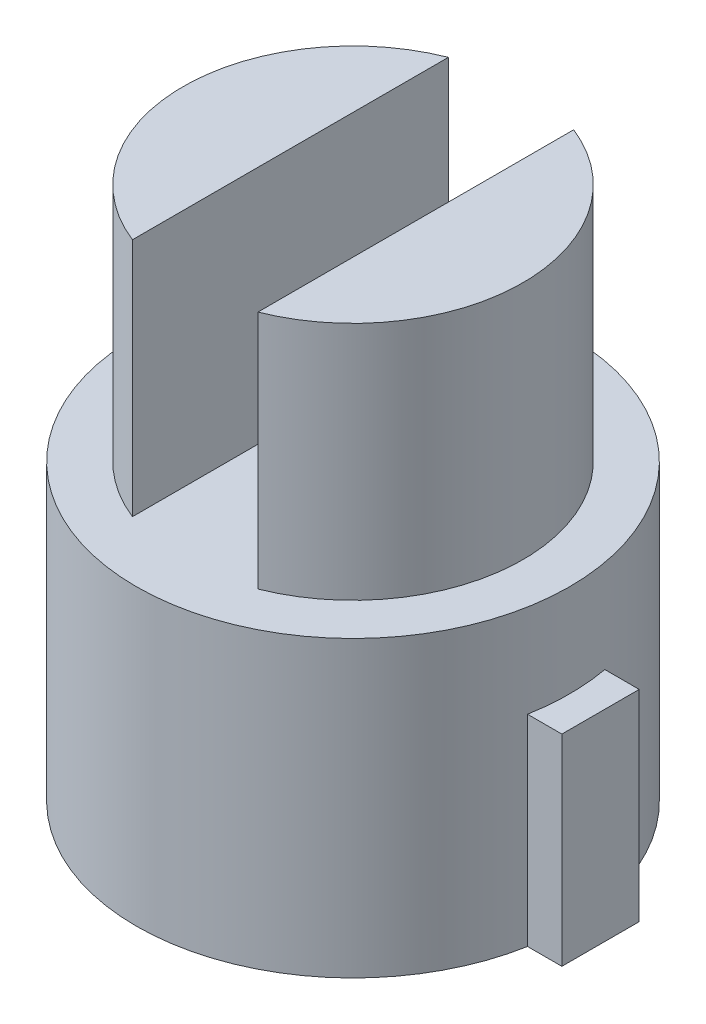
ISO-10303-21;
HEADER;
FILE_DESCRIPTION(('STEP AP214'),'2;1');
FILE_NAME('part.step','',(''),(''),'','','');
FILE_SCHEMA(('AUTOMOTIVE_DESIGN { 1 0 10303 214 1 1 1 1 }'));
ENDSEC;
DATA;
#1=APPLICATION_CONTEXT('core data for automotive mechanical design processes');
#2=APPLICATION_PROTOCOL_DEFINITION('international standard','automotive_design',2000,#1);
#3=PRODUCT_CONTEXT('',#1,'mechanical');
#4=PRODUCT('Part','Part','',(#3));
#5=PRODUCT_RELATED_PRODUCT_CATEGORY('part','',(#4));
#6=PRODUCT_DEFINITION_FORMATION('','',#4);
#7=PRODUCT_DEFINITION_CONTEXT('part definition',#1,'design');
#8=PRODUCT_DEFINITION('design','',#6,#7);
#9=PRODUCT_DEFINITION_SHAPE('','',#8);
#10=(LENGTH_UNIT() NAMED_UNIT(*) SI_UNIT(.MILLI.,.METRE.));
#11=(NAMED_UNIT(*) PLANE_ANGLE_UNIT() SI_UNIT($,.RADIAN.));
#12=(NAMED_UNIT(*) SI_UNIT($,.STERADIAN.) SOLID_ANGLE_UNIT());
#13=UNCERTAINTY_MEASURE_WITH_UNIT(LENGTH_MEASURE(1.E-05),#10,'distance_accuracy_value','');
#14=(GEOMETRIC_REPRESENTATION_CONTEXT(3) GLOBAL_UNCERTAINTY_ASSIGNED_CONTEXT((#13)) GLOBAL_UNIT_ASSIGNED_CONTEXT((#10,
#11,#12)) REPRESENTATION_CONTEXT('',''));
#15=CARTESIAN_POINT('',(0.,0.,0.));
#16=DIRECTION('',(0.,0.,1.));
#17=DIRECTION('',(1.,0.,0.));
#18=AXIS2_PLACEMENT_3D('',#15,#16,#17);
#19=CARTESIAN_POINT('',(0.,19.,0.));
#20=DIRECTION('',(0.,-1.,0.));
#21=DIRECTION('',(0.,0.,-1.));
#22=AXIS2_PLACEMENT_3D('',#19,#20,#21);
#23=CYLINDRICAL_SURFACE('',#22,14.);
#24=CARTESIAN_POINT('',(0.,19.,0.));
#25=DIRECTION('',(0.,1.,0.));
#26=DIRECTION('',(0.,0.,1.));
#27=AXIS2_PLACEMENT_3D('',#24,#25,#26);
#28=CIRCLE('',#27,14.);
#29=CARTESIAN_POINT('',(0.,19.,14.));
#30=VERTEX_POINT('',#29);
#31=EDGE_CURVE('E217',#30,#30,#28,.T.);
#32=ORIENTED_EDGE('',*,*,#31,.F.);
#33=EDGE_LOOP('',(#32));
#34=FACE_BOUND('',#33,.T.);
#35=DIRECTION('',(0.,-1.,0.));
#36=VECTOR('',#35,1.);
#37=CARTESIAN_POINT('',(13.7752957501457,13.,2.49824478304639));
#38=LINE('',#37,#36);
#39=CARTESIAN_POINT('',(13.7752957501457,13.,2.49824478304639));
#40=VERTEX_POINT('',#39);
#41=CARTESIAN_POINT('',(13.7752957501457,0.,2.49824478304639));
#42=VERTEX_POINT('',#41);
#43=EDGE_CURVE('E65',#40,#42,#38,.T.);
#44=ORIENTED_EDGE('',*,*,#43,.F.);
#45=CARTESIAN_POINT('',(0.,13.,0.));
#46=DIRECTION('',(0.,1.,0.));
#47=DIRECTION('',(0.,0.,1.));
#48=AXIS2_PLACEMENT_3D('',#45,#46,#47);
#49=CIRCLE('',#48,14.);
#50=CARTESIAN_POINT('',(13.7749773139559,13.,-2.5));
#51=VERTEX_POINT('',#50);
#52=EDGE_CURVE('E60',#40,#51,#49,.T.);
#53=ORIENTED_EDGE('',*,*,#52,.T.);
#54=DIRECTION('',(0.,-1.,0.));
#55=VECTOR('',#54,1.);
#56=CARTESIAN_POINT('',(13.7749773139559,13.,-2.5));
#57=LINE('',#56,#55);
#58=CARTESIAN_POINT('',(13.7749773139559,0.,-2.5));
#59=VERTEX_POINT('',#58);
#60=EDGE_CURVE('E155',#51,#59,#57,.T.);
#61=ORIENTED_EDGE('',*,*,#60,.T.);
#62=CARTESIAN_POINT('',(0.,0.,0.));
#63=DIRECTION('',(0.,1.,0.));
#64=DIRECTION('',(0.,0.,1.));
#65=AXIS2_PLACEMENT_3D('',#62,#63,#64);
#66=CIRCLE('',#65,14.);
#67=CARTESIAN_POINT('',(-13.7746586467486,0.,-2.50175521695361));
#68=VERTEX_POINT('',#67);
#69=EDGE_CURVE('E208',#59,#68,#66,.T.);
#70=ORIENTED_EDGE('',*,*,#69,.T.);
#71=DIRECTION('',(0.,-1.,0.));
#72=VECTOR('',#71,1.);
#73=CARTESIAN_POINT('',(-13.7746586467486,13.,-2.50175521695361));
#74=LINE('',#73,#72);
#75=CARTESIAN_POINT('',(-13.7746586467486,13.,-2.50175521695361));
#76=VERTEX_POINT('',#75);
#77=EDGE_CURVE('E194',#76,#68,#74,.T.);
#78=ORIENTED_EDGE('',*,*,#77,.F.);
#79=CARTESIAN_POINT('',(0.,13.,0.));
#80=DIRECTION('',(0.,1.,0.));
#81=DIRECTION('',(0.,0.,1.));
#82=AXIS2_PLACEMENT_3D('',#79,#80,#81);
#83=CIRCLE('',#82,14.);
#84=CARTESIAN_POINT('',(-13.7752957501457,13.,2.49824478304639));
#85=VERTEX_POINT('',#84);
#86=EDGE_CURVE('E169',#76,#85,#83,.T.);
#87=ORIENTED_EDGE('',*,*,#86,.T.);
#88=DIRECTION('',(0.,-1.,0.));
#89=VECTOR('',#88,1.);
#90=CARTESIAN_POINT('',(-13.7752957501457,13.,2.49824478304639));
#91=LINE('',#90,#89);
#92=CARTESIAN_POINT('',(-13.7752957501457,0.,2.49824478304639));
#93=VERTEX_POINT('',#92);
#94=EDGE_CURVE('E180',#85,#93,#91,.T.);
#95=ORIENTED_EDGE('',*,*,#94,.T.);
#96=EDGE_CURVE('E213',#93,#42,#66,.T.);
#97=ORIENTED_EDGE('',*,*,#96,.T.);
#98=EDGE_LOOP('',(#44,#53,#61,#70,#78,#87,#95,#97));
#99=FACE_BOUND('',#98,.T.);
#100=ADVANCED_FACE('F45',(#34,#99),#23,.T.);
#101=CARTESIAN_POINT('',(-4.0434886577585,34.5,0.));
#102=DIRECTION('',(1.,0.,0.));
#103=DIRECTION('',(0.,0.,-1.));
#104=AXIS2_PLACEMENT_3D('',#101,#102,#103);
#105=PLANE('',#104);
#106=DIRECTION('',(0.,0.,1.));
#107=VECTOR('',#106,1.);
#108=CARTESIAN_POINT('',(-4.0434886577585,19.,0.));
#109=LINE('',#108,#107);
#110=CARTESIAN_POINT('',(-4.0434886577585,19.,-10.2083592939599));
#111=VERTEX_POINT('',#110);
#112=CARTESIAN_POINT('',(-4.0434886577585,19.,10.2083592939599));
#113=VERTEX_POINT('',#112);
#114=EDGE_CURVE('E220',#111,#113,#109,.T.);
#115=ORIENTED_EDGE('',*,*,#114,.F.);
#116=DIRECTION('',(0.,-1.,0.));
#117=VECTOR('',#116,1.);
#118=CARTESIAN_POINT('',(-4.0434886577585,34.5,-10.2083592939599));
#119=LINE('',#118,#117);
#120=CARTESIAN_POINT('',(-4.0434886577585,34.5,-10.2083592939599));
#121=VERTEX_POINT('',#120);
#122=EDGE_CURVE('E11',#121,#111,#119,.T.);
#123=ORIENTED_EDGE('',*,*,#122,.F.);
#124=DIRECTION('',(0.,0.,1.));
#125=VECTOR('',#124,1.);
#126=CARTESIAN_POINT('',(-4.0434886577585,34.5,0.));
#127=LINE('',#126,#125);
#128=CARTESIAN_POINT('',(-4.0434886577585,34.5,10.2083592939599));
#129=VERTEX_POINT('',#128);
#130=EDGE_CURVE('E223',#121,#129,#127,.T.);
#131=ORIENTED_EDGE('',*,*,#130,.T.);
#132=DIRECTION('',(0.,-1.,0.));
#133=VECTOR('',#132,1.);
#134=CARTESIAN_POINT('',(-4.0434886577585,34.5,10.2083592939599));
#135=LINE('',#134,#133);
#136=EDGE_CURVE('E53',#129,#113,#135,.T.);
#137=ORIENTED_EDGE('',*,*,#136,.T.);
#138=EDGE_LOOP('',(#115,#123,#131,#137));
#139=FACE_BOUND('',#138,.T.);
#140=ADVANCED_FACE('F47',(#139),#105,.T.);
#141=CARTESIAN_POINT('',(0.,34.5,0.));
#142=DIRECTION('',(0.,-1.,0.));
#143=DIRECTION('',(0.,0.,-1.));
#144=AXIS2_PLACEMENT_3D('',#141,#142,#143);
#145=CYLINDRICAL_SURFACE('',#144,10.98);
#146=ORIENTED_EDGE('',*,*,#122,.T.);
#147=CARTESIAN_POINT('',(0.,19.,0.));
#148=DIRECTION('',(0.,1.,0.));
#149=DIRECTION('',(0.,0.,1.));
#150=AXIS2_PLACEMENT_3D('',#147,#148,#149);
#151=CIRCLE('',#150,10.98);
#152=EDGE_CURVE('E214',#111,#113,#151,.T.);
#153=ORIENTED_EDGE('',*,*,#152,.T.);
#154=ORIENTED_EDGE('',*,*,#136,.F.);
#155=CARTESIAN_POINT('',(0.,34.5,0.));
#156=DIRECTION('',(0.,1.,0.));
#157=DIRECTION('',(0.,0.,1.));
#158=AXIS2_PLACEMENT_3D('',#155,#156,#157);
#159=CIRCLE('',#158,10.98);
#160=EDGE_CURVE('E226',#121,#129,#159,.T.);
#161=ORIENTED_EDGE('',*,*,#160,.F.);
#162=EDGE_LOOP('',(#146,#153,#154,#161));
#163=FACE_BOUND('',#162,.T.);
#164=ADVANCED_FACE('F235',(#163),#145,.T.);
#165=CARTESIAN_POINT('',(0.,34.5,0.));
#166=DIRECTION('',(0.,1.,0.));
#167=DIRECTION('',(0.,0.,1.));
#168=AXIS2_PLACEMENT_3D('',#165,#166,#167);
#169=PLANE('',#168);
#170=ORIENTED_EDGE('',*,*,#130,.F.);
#171=ORIENTED_EDGE('',*,*,#160,.T.);
#172=EDGE_LOOP('',(#170,#171));
#173=FACE_BOUND('',#172,.T.);
#174=ADVANCED_FACE('F240',(#173),#169,.T.);
#175=CARTESIAN_POINT('',(0.,19.,0.));
#176=DIRECTION('',(0.,1.,0.));
#177=DIRECTION('',(0.,0.,1.));
#178=AXIS2_PLACEMENT_3D('',#175,#176,#177);
#179=PLANE('',#178);
#180=CARTESIAN_POINT('',(4.05821882413903,19.,10.2025124344645));
#181=VERTEX_POINT('',#180);
#182=CARTESIAN_POINT('',(4.05821882413903,19.,-10.2025124344645));
#183=VERTEX_POINT('',#182);
#184=EDGE_CURVE('E209',#181,#183,#151,.T.);
#185=ORIENTED_EDGE('',*,*,#184,.F.);
#186=DIRECTION('',(0.,0.,1.));
#187=VECTOR('',#186,1.);
#188=CARTESIAN_POINT('',(4.05821882413903,19.,0.));
#189=LINE('',#188,#187);
#190=EDGE_CURVE('E212',#183,#181,#189,.T.);
#191=ORIENTED_EDGE('',*,*,#190,.F.);
#192=EDGE_LOOP('',(#185,#191));
#193=FACE_BOUND('',#192,.T.);
#194=ORIENTED_EDGE('',*,*,#31,.T.);
#195=EDGE_LOOP('',(#194));
#196=FACE_BOUND('',#195,.T.);
#197=ORIENTED_EDGE('',*,*,#114,.T.);
#198=ORIENTED_EDGE('',*,*,#152,.F.);
#199=EDGE_LOOP('',(#197,#198));
#200=FACE_BOUND('',#199,.T.);
#201=ADVANCED_FACE('F237',(#193,#196,#200),#179,.T.);
#202=CARTESIAN_POINT('',(0.,0.,0.));
#203=DIRECTION('',(0.,1.,0.));
#204=DIRECTION('',(0.,0.,1.));
#205=AXIS2_PLACEMENT_3D('',#202,#203,#204);
#206=PLANE('',#205);
#207=ORIENTED_EDGE('',*,*,#96,.F.);
#208=DIRECTION('',(-1.,0.,0.));
#209=VECTOR('',#208,1.);
#210=CARTESIAN_POINT('',(0.,0.,2.49824478304639));
#211=LINE('',#210,#209);
#212=CARTESIAN_POINT('',(-16.,0.,2.49824478304639));
#213=VERTEX_POINT('',#212);
#214=EDGE_CURVE('E172',#93,#213,#211,.T.);
#215=ORIENTED_EDGE('',*,*,#214,.T.);
#216=DIRECTION('',(0.,0.,-1.));
#217=VECTOR('',#216,1.);
#218=CARTESIAN_POINT('',(-16.,0.,0.));
#219=LINE('',#218,#217);
#220=CARTESIAN_POINT('',(-16.,0.,-2.50175521695361));
#221=VERTEX_POINT('',#220);
#222=EDGE_CURVE('E183',#213,#221,#219,.T.);
#223=ORIENTED_EDGE('',*,*,#222,.T.);
#224=DIRECTION('',(-1.,0.,0.));
#225=VECTOR('',#224,1.);
#226=CARTESIAN_POINT('',(0.,0.,-2.50175521695361));
#227=LINE('',#226,#225);
#228=EDGE_CURVE('E168',#68,#221,#227,.T.);
#229=ORIENTED_EDGE('',*,*,#228,.F.);
#230=ORIENTED_EDGE('',*,*,#69,.F.);
#231=DIRECTION('',(1.,0.,0.));
#232=VECTOR('',#231,1.);
#233=CARTESIAN_POINT('',(0.,0.,-2.5));
#234=LINE('',#233,#232);
#235=CARTESIAN_POINT('',(15.9953222609992,0.,-2.5));
#236=VERTEX_POINT('',#235);
#237=EDGE_CURVE('E162',#59,#236,#234,.T.);
#238=ORIENTED_EDGE('',*,*,#237,.T.);
#239=DIRECTION('',(0.,0.,-1.));
#240=VECTOR('',#239,1.);
#241=CARTESIAN_POINT('',(15.9953222609992,0.,0.));
#242=LINE('',#241,#240);
#243=CARTESIAN_POINT('',(15.9953222609992,0.,2.49824478304639));
#244=VERTEX_POINT('',#243);
#245=EDGE_CURVE('E160',#244,#236,#242,.T.);
#246=ORIENTED_EDGE('',*,*,#245,.F.);
#247=DIRECTION('',(1.,0.,0.));
#248=VECTOR('',#247,1.);
#249=CARTESIAN_POINT('',(0.,0.,2.49824478304639));
#250=LINE('',#249,#248);
#251=EDGE_CURVE('E145',#42,#244,#250,.T.);
#252=ORIENTED_EDGE('',*,*,#251,.F.);
#253=EDGE_LOOP('',(#207,#215,#223,#229,#230,#238,#246,#252));
#254=FACE_BOUND('',#253,.T.);
#255=ADVANCED_FACE('F239',(#254),#206,.F.);
#256=CARTESIAN_POINT('',(4.05821882413903,34.5,0.));
#257=DIRECTION('',(1.,0.,0.));
#258=DIRECTION('',(0.,0.,-1.));
#259=AXIS2_PLACEMENT_3D('',#256,#257,#258);
#260=PLANE('',#259);
#261=ORIENTED_EDGE('',*,*,#190,.T.);
#262=DIRECTION('',(0.,-1.,0.));
#263=VECTOR('',#262,1.);
#264=CARTESIAN_POINT('',(4.05821882413903,34.5,10.2025124344645));
#265=LINE('',#264,#263);
#266=CARTESIAN_POINT('',(4.05821882413903,34.5,10.2025124344645));
#267=VERTEX_POINT('',#266);
#268=EDGE_CURVE('E205',#267,#181,#265,.T.);
#269=ORIENTED_EDGE('',*,*,#268,.F.);
#270=DIRECTION('',(0.,0.,1.));
#271=VECTOR('',#270,1.);
#272=CARTESIAN_POINT('',(4.05821882413903,34.5,0.));
#273=LINE('',#272,#271);
#274=CARTESIAN_POINT('',(4.05821882413903,34.5,-10.2025124344645));
#275=VERTEX_POINT('',#274);
#276=EDGE_CURVE('E197',#275,#267,#273,.T.);
#277=ORIENTED_EDGE('',*,*,#276,.F.);
#278=DIRECTION('',(0.,-1.,0.));
#279=VECTOR('',#278,1.);
#280=CARTESIAN_POINT('',(4.05821882413903,34.5,-10.2025124344645));
#281=LINE('',#280,#279);
#282=EDGE_CURVE('E202',#275,#183,#281,.T.);
#283=ORIENTED_EDGE('',*,*,#282,.T.);
#284=EDGE_LOOP('',(#261,#269,#277,#283));
#285=FACE_BOUND('',#284,.T.);
#286=ADVANCED_FACE('F247',(#285),#260,.F.);
#287=CARTESIAN_POINT('',(0.,34.5,0.));
#288=DIRECTION('',(0.,-1.,0.));
#289=DIRECTION('',(0.,0.,-1.));
#290=AXIS2_PLACEMENT_3D('',#287,#288,#289);
#291=CYLINDRICAL_SURFACE('',#290,10.98);
#292=ORIENTED_EDGE('',*,*,#184,.T.);
#293=ORIENTED_EDGE('',*,*,#282,.F.);
#294=CARTESIAN_POINT('',(0.,34.5,0.));
#295=DIRECTION('',(0.,1.,0.));
#296=DIRECTION('',(0.,0.,1.));
#297=AXIS2_PLACEMENT_3D('',#294,#295,#296);
#298=CIRCLE('',#297,10.98);
#299=EDGE_CURVE('E200',#267,#275,#298,.T.);
#300=ORIENTED_EDGE('',*,*,#299,.F.);
#301=ORIENTED_EDGE('',*,*,#268,.T.);
#302=EDGE_LOOP('',(#292,#293,#300,#301));
#303=FACE_BOUND('',#302,.T.);
#304=ADVANCED_FACE('F304',(#303),#291,.T.);
#305=CARTESIAN_POINT('',(0.,34.5,0.));
#306=DIRECTION('',(0.,1.,0.));
#307=DIRECTION('',(0.,0.,1.));
#308=AXIS2_PLACEMENT_3D('',#305,#306,#307);
#309=PLANE('',#308);
#310=ORIENTED_EDGE('',*,*,#276,.T.);
#311=ORIENTED_EDGE('',*,*,#299,.T.);
#312=EDGE_LOOP('',(#310,#311));
#313=FACE_BOUND('',#312,.T.);
#314=ADVANCED_FACE('F315',(#313),#309,.T.);
#315=CARTESIAN_POINT('',(0.,13.,-2.50175521695361));
#316=DIRECTION('',(0.,0.,1.));
#317=DIRECTION('',(1.,0.,0.));
#318=AXIS2_PLACEMENT_3D('',#315,#316,#317);
#319=PLANE('',#318);
#320=ORIENTED_EDGE('',*,*,#228,.T.);
#321=DIRECTION('',(0.,-1.,0.));
#322=VECTOR('',#321,1.);
#323=CARTESIAN_POINT('',(-16.,13.,-2.50175521695361));
#324=LINE('',#323,#322);
#325=CARTESIAN_POINT('',(-16.,13.,-2.50175521695361));
#326=VERTEX_POINT('',#325);
#327=EDGE_CURVE('E192',#326,#221,#324,.T.);
#328=ORIENTED_EDGE('',*,*,#327,.F.);
#329=DIRECTION('',(-1.,0.,0.));
#330=VECTOR('',#329,1.);
#331=CARTESIAN_POINT('',(0.,13.,-2.50175521695361));
#332=LINE('',#331,#330);
#333=EDGE_CURVE('E171',#76,#326,#332,.T.);
#334=ORIENTED_EDGE('',*,*,#333,.F.);
#335=ORIENTED_EDGE('',*,*,#77,.T.);
#336=EDGE_LOOP('',(#320,#328,#334,#335));
#337=FACE_BOUND('',#336,.T.);
#338=ADVANCED_FACE('F326',(#337),#319,.F.);
#339=CARTESIAN_POINT('',(-16.,13.,0.));
#340=DIRECTION('',(-1.,0.,0.));
#341=DIRECTION('',(0.,0.,1.));
#342=AXIS2_PLACEMENT_3D('',#339,#340,#341);
#343=PLANE('',#342);
#344=ORIENTED_EDGE('',*,*,#222,.F.);
#345=DIRECTION('',(0.,-1.,0.));
#346=VECTOR('',#345,1.);
#347=CARTESIAN_POINT('',(-16.,13.,2.49824478304639));
#348=LINE('',#347,#346);
#349=CARTESIAN_POINT('',(-16.,13.,2.49824478304639));
#350=VERTEX_POINT('',#349);
#351=EDGE_CURVE('E190',#350,#213,#348,.T.);
#352=ORIENTED_EDGE('',*,*,#351,.F.);
#353=DIRECTION('',(0.,0.,-1.));
#354=VECTOR('',#353,1.);
#355=CARTESIAN_POINT('',(-16.,13.,0.));
#356=LINE('',#355,#354);
#357=EDGE_CURVE('E174',#350,#326,#356,.T.);
#358=ORIENTED_EDGE('',*,*,#357,.T.);
#359=ORIENTED_EDGE('',*,*,#327,.T.);
#360=EDGE_LOOP('',(#344,#352,#358,#359));
#361=FACE_BOUND('',#360,.T.);
#362=ADVANCED_FACE('F351',(#361),#343,.T.);
#363=CARTESIAN_POINT('',(0.,13.,2.49824478304639));
#364=DIRECTION('',(0.,0.,1.));
#365=DIRECTION('',(1.,0.,0.));
#366=AXIS2_PLACEMENT_3D('',#363,#364,#365);
#367=PLANE('',#366);
#368=ORIENTED_EDGE('',*,*,#214,.F.);
#369=ORIENTED_EDGE('',*,*,#94,.F.);
#370=DIRECTION('',(-1.,0.,0.));
#371=VECTOR('',#370,1.);
#372=CARTESIAN_POINT('',(0.,13.,2.49824478304639));
#373=LINE('',#372,#371);
#374=EDGE_CURVE('E177',#85,#350,#373,.T.);
#375=ORIENTED_EDGE('',*,*,#374,.T.);
#376=ORIENTED_EDGE('',*,*,#351,.T.);
#377=EDGE_LOOP('',(#368,#369,#375,#376));
#378=FACE_BOUND('',#377,.T.);
#379=ADVANCED_FACE('F362',(#378),#367,.T.);
#380=CARTESIAN_POINT('',(0.,13.,0.));
#381=DIRECTION('',(0.,1.,0.));
#382=DIRECTION('',(0.,0.,1.));
#383=AXIS2_PLACEMENT_3D('',#380,#381,#382);
#384=PLANE('',#383);
#385=ORIENTED_EDGE('',*,*,#86,.F.);
#386=ORIENTED_EDGE('',*,*,#333,.T.);
#387=ORIENTED_EDGE('',*,*,#357,.F.);
#388=ORIENTED_EDGE('',*,*,#374,.F.);
#389=EDGE_LOOP('',(#385,#386,#387,#388));
#390=FACE_BOUND('',#389,.T.);
#391=ADVANCED_FACE('F372',(#390),#384,.T.);
#392=CARTESIAN_POINT('',(0.,13.,2.49824478304639));
#393=DIRECTION('',(0.,0.,-1.));
#394=DIRECTION('',(-1.,0.,0.));
#395=AXIS2_PLACEMENT_3D('',#392,#393,#394);
#396=PLANE('',#395);
#397=ORIENTED_EDGE('',*,*,#251,.T.);
#398=DIRECTION('',(0.,-1.,0.));
#399=VECTOR('',#398,1.);
#400=CARTESIAN_POINT('',(15.9953222609992,13.,2.49824478304639));
#401=LINE('',#400,#399);
#402=CARTESIAN_POINT('',(15.9953222609992,13.,2.49824478304639));
#403=VERTEX_POINT('',#402);
#404=EDGE_CURVE('E142',#403,#244,#401,.T.);
#405=ORIENTED_EDGE('',*,*,#404,.F.);
#406=DIRECTION('',(1.,0.,0.));
#407=VECTOR('',#406,1.);
#408=CARTESIAN_POINT('',(0.,13.,2.49824478304639));
#409=LINE('',#408,#407);
#410=EDGE_CURVE('E132',#40,#403,#409,.T.);
#411=ORIENTED_EDGE('',*,*,#410,.F.);
#412=ORIENTED_EDGE('',*,*,#43,.T.);
#413=EDGE_LOOP('',(#397,#405,#411,#412));
#414=FACE_BOUND('',#413,.T.);
#415=ADVANCED_FACE('F143',(#414),#396,.F.);
#416=CARTESIAN_POINT('',(15.9953222609992,13.,0.));
#417=DIRECTION('',(-1.,0.,0.));
#418=DIRECTION('',(0.,0.,1.));
#419=AXIS2_PLACEMENT_3D('',#416,#417,#418);
#420=PLANE('',#419);
#421=ORIENTED_EDGE('',*,*,#245,.T.);
#422=DIRECTION('',(0.,-1.,0.));
#423=VECTOR('',#422,1.);
#424=CARTESIAN_POINT('',(15.9953222609992,13.,-2.5));
#425=LINE('',#424,#423);
#426=CARTESIAN_POINT('',(15.9953222609992,13.,-2.5));
#427=VERTEX_POINT('',#426);
#428=EDGE_CURVE('E149',#427,#236,#425,.T.);
#429=ORIENTED_EDGE('',*,*,#428,.F.);
#430=DIRECTION('',(0.,0.,-1.));
#431=VECTOR('',#430,1.);
#432=CARTESIAN_POINT('',(15.9953222609992,13.,0.));
#433=LINE('',#432,#431);
#434=EDGE_CURVE('E137',#403,#427,#433,.T.);
#435=ORIENTED_EDGE('',*,*,#434,.F.);
#436=ORIENTED_EDGE('',*,*,#404,.T.);
#437=EDGE_LOOP('',(#421,#429,#435,#436));
#438=FACE_BOUND('',#437,.T.);
#439=ADVANCED_FACE('F151',(#438),#420,.F.);
#440=CARTESIAN_POINT('',(0.,13.,-2.5));
#441=DIRECTION('',(0.,0.,-1.));
#442=DIRECTION('',(-1.,0.,0.));
#443=AXIS2_PLACEMENT_3D('',#440,#441,#442);
#444=PLANE('',#443);
#445=ORIENTED_EDGE('',*,*,#237,.F.);
#446=ORIENTED_EDGE('',*,*,#60,.F.);
#447=DIRECTION('',(1.,0.,0.));
#448=VECTOR('',#447,1.);
#449=CARTESIAN_POINT('',(0.,13.,-2.5));
#450=LINE('',#449,#448);
#451=EDGE_CURVE('E153',#51,#427,#450,.T.);
#452=ORIENTED_EDGE('',*,*,#451,.T.);
#453=ORIENTED_EDGE('',*,*,#428,.T.);
#454=EDGE_LOOP('',(#445,#446,#452,#453));
#455=FACE_BOUND('',#454,.T.);
#456=ADVANCED_FACE('F399',(#455),#444,.T.);
#457=CARTESIAN_POINT('',(0.,13.,0.));
#458=DIRECTION('',(0.,1.,0.));
#459=DIRECTION('',(0.,0.,1.));
#460=AXIS2_PLACEMENT_3D('',#457,#458,#459);
#461=PLANE('',#460);
#462=ORIENTED_EDGE('',*,*,#52,.F.);
#463=ORIENTED_EDGE('',*,*,#410,.T.);
#464=ORIENTED_EDGE('',*,*,#434,.T.);
#465=ORIENTED_EDGE('',*,*,#451,.F.);
#466=EDGE_LOOP('',(#462,#463,#464,#465));
#467=FACE_BOUND('',#466,.T.);
#468=ADVANCED_FACE('F134',(#467),#461,.T.);
#469=CLOSED_SHELL('',(#100,#140,#164,#174,#201,#255,#286,#304,#314,#338,#362,#379,#391,#415,
#439,#456,#468));
#470=MANIFOLD_SOLID_BREP('B2',#469);
#471=ADVANCED_BREP_SHAPE_REPRESENTATION('',(#18,#470),#14);
#472=SHAPE_DEFINITION_REPRESENTATION(#9,#471);
ENDSEC;
END-ISO-10303-21;
